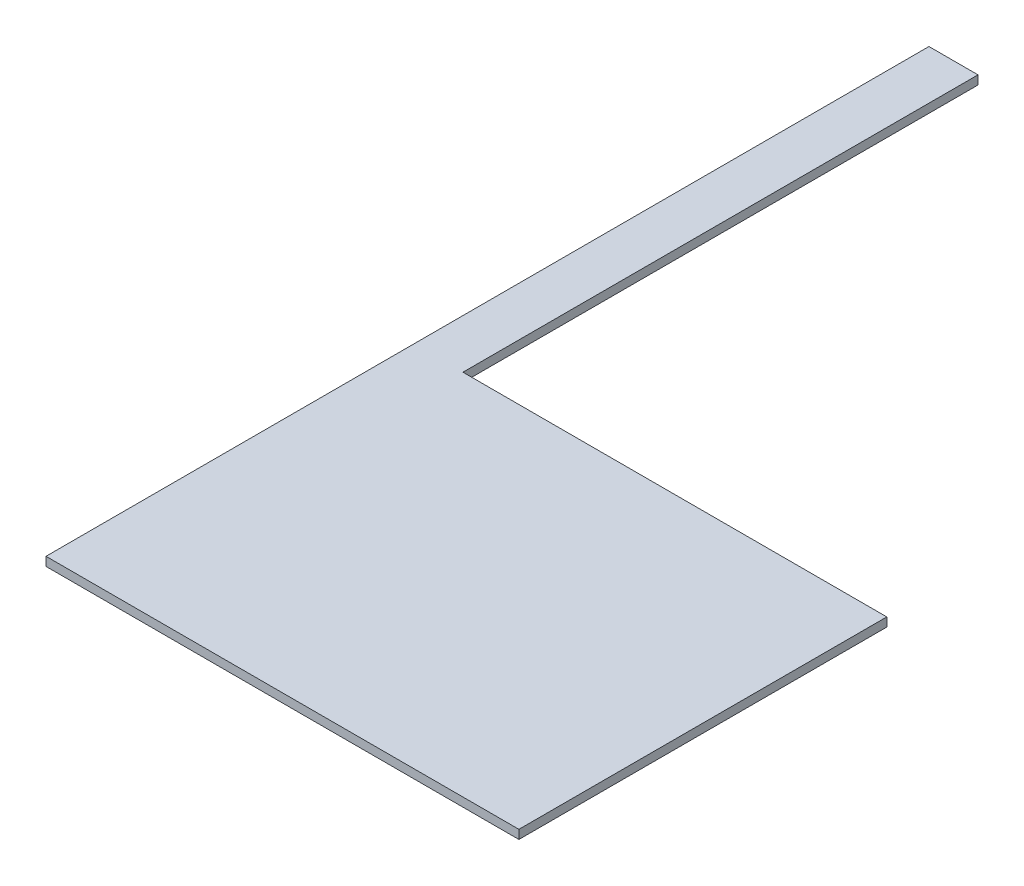
ISO-10303-21;
HEADER;
FILE_DESCRIPTION(('STEP AP214'),'2;1');
FILE_NAME('part.step','',(''),(''),'','','');
FILE_SCHEMA(('AUTOMOTIVE_DESIGN { 1 0 10303 214 1 1 1 1 }'));
ENDSEC;
DATA;
#1=APPLICATION_CONTEXT('core data for automotive mechanical design processes');
#2=APPLICATION_PROTOCOL_DEFINITION('international standard','automotive_design',2000,#1);
#3=PRODUCT_CONTEXT('',#1,'mechanical');
#4=PRODUCT('Part','Part','',(#3));
#5=PRODUCT_RELATED_PRODUCT_CATEGORY('part','',(#4));
#6=PRODUCT_DEFINITION_FORMATION('','',#4);
#7=PRODUCT_DEFINITION_CONTEXT('part definition',#1,'design');
#8=PRODUCT_DEFINITION('design','',#6,#7);
#9=PRODUCT_DEFINITION_SHAPE('','',#8);
#10=(LENGTH_UNIT() NAMED_UNIT(*) SI_UNIT(.MILLI.,.METRE.));
#11=(NAMED_UNIT(*) PLANE_ANGLE_UNIT() SI_UNIT($,.RADIAN.));
#12=(NAMED_UNIT(*) SI_UNIT($,.STERADIAN.) SOLID_ANGLE_UNIT());
#13=UNCERTAINTY_MEASURE_WITH_UNIT(LENGTH_MEASURE(1.E-05),#10,'distance_accuracy_value','');
#14=(GEOMETRIC_REPRESENTATION_CONTEXT(3) GLOBAL_UNCERTAINTY_ASSIGNED_CONTEXT((#13)) GLOBAL_UNIT_ASSIGNED_CONTEXT((#10,
#11,#12)) REPRESENTATION_CONTEXT('',''));
#15=CARTESIAN_POINT('',(0.,0.,0.));
#16=DIRECTION('',(0.,0.,1.));
#17=DIRECTION('',(1.,0.,0.));
#18=AXIS2_PLACEMENT_3D('',#15,#16,#17);
#19=CARTESIAN_POINT('',(-388.14375,18.25625,-381.));
#20=DIRECTION('',(0.,0.,1.));
#21=DIRECTION('',(1.,0.,0.));
#22=AXIS2_PLACEMENT_3D('',#19,#20,#21);
#23=PLANE('',#22);
#24=DIRECTION('',(-1.,0.,0.));
#25=VECTOR('',#24,1.);
#26=CARTESIAN_POINT('',(-388.14375,0.,-381.));
#27=LINE('',#26,#25);
#28=CARTESIAN_POINT('',(489.74375,0.,-381.));
#29=VERTEX_POINT('',#28);
#30=CARTESIAN_POINT('',(-388.14375,0.,-381.));
#31=VERTEX_POINT('',#30);
#32=EDGE_CURVE('E127',#29,#31,#27,.T.);
#33=ORIENTED_EDGE('',*,*,#32,.T.);
#34=DIRECTION('',(0.,-1.,0.));
#35=VECTOR('',#34,1.);
#36=CARTESIAN_POINT('',(-388.14375,18.25625,-381.));
#37=LINE('',#36,#35);
#38=CARTESIAN_POINT('',(-388.14375,18.25625,-381.));
#39=VERTEX_POINT('',#38);
#40=EDGE_CURVE('E11',#39,#31,#37,.T.);
#41=ORIENTED_EDGE('',*,*,#40,.F.);
#42=DIRECTION('',(-1.,0.,0.));
#43=VECTOR('',#42,1.);
#44=CARTESIAN_POINT('',(-388.14375,18.25625,-381.));
#45=LINE('',#44,#43);
#46=CARTESIAN_POINT('',(489.74375,18.25625,-381.));
#47=VERTEX_POINT('',#46);
#48=EDGE_CURVE('E144',#47,#39,#45,.T.);
#49=ORIENTED_EDGE('',*,*,#48,.F.);
#50=DIRECTION('',(0.,-1.,0.));
#51=VECTOR('',#50,1.);
#52=CARTESIAN_POINT('',(489.74375,18.25625,-381.));
#53=LINE('',#52,#51);
#54=EDGE_CURVE('E123',#47,#29,#53,.T.);
#55=ORIENTED_EDGE('',*,*,#54,.T.);
#56=EDGE_LOOP('',(#33,#41,#49,#55));
#57=FACE_BOUND('',#56,.T.);
#58=ADVANCED_FACE('F39',(#57),#23,.F.);
#59=CARTESIAN_POINT('',(-388.14375,18.25625,-1447.8));
#60=DIRECTION('',(-1.,0.,0.));
#61=DIRECTION('',(0.,0.,1.));
#62=AXIS2_PLACEMENT_3D('',#59,#60,#61);
#63=PLANE('',#62);
#64=DIRECTION('',(0.,0.,-1.));
#65=VECTOR('',#64,1.);
#66=CARTESIAN_POINT('',(-388.14375,0.,-1447.8));
#67=LINE('',#66,#65);
#68=CARTESIAN_POINT('',(-388.14375,0.,-1447.8));
#69=VERTEX_POINT('',#68);
#70=EDGE_CURVE('E131',#31,#69,#67,.T.);
#71=ORIENTED_EDGE('',*,*,#70,.T.);
#72=DIRECTION('',(0.,-1.,0.));
#73=VECTOR('',#72,1.);
#74=CARTESIAN_POINT('',(-388.14375,18.25625,-1447.8));
#75=LINE('',#74,#73);
#76=CARTESIAN_POINT('',(-388.14375,18.25625,-1447.8));
#77=VERTEX_POINT('',#76);
#78=EDGE_CURVE('E48',#77,#69,#75,.T.);
#79=ORIENTED_EDGE('',*,*,#78,.F.);
#80=DIRECTION('',(0.,0.,-1.));
#81=VECTOR('',#80,1.);
#82=CARTESIAN_POINT('',(-388.14375,18.25625,-1447.8));
#83=LINE('',#82,#81);
#84=EDGE_CURVE('E93',#39,#77,#83,.T.);
#85=ORIENTED_EDGE('',*,*,#84,.F.);
#86=ORIENTED_EDGE('',*,*,#40,.T.);
#87=EDGE_LOOP('',(#71,#79,#85,#86));
#88=FACE_BOUND('',#87,.T.);
#89=ADVANCED_FACE('F172',(#88),#63,.F.);
#90=CARTESIAN_POINT('',(-489.74375,18.25625,-1447.8));
#91=DIRECTION('',(0.,0.,1.));
#92=DIRECTION('',(1.,0.,0.));
#93=AXIS2_PLACEMENT_3D('',#90,#91,#92);
#94=PLANE('',#93);
#95=DIRECTION('',(-1.,0.,0.));
#96=VECTOR('',#95,1.);
#97=CARTESIAN_POINT('',(-489.74375,0.,-1447.8));
#98=LINE('',#97,#96);
#99=CARTESIAN_POINT('',(-489.74375,0.,-1447.8));
#100=VERTEX_POINT('',#99);
#101=EDGE_CURVE('E134',#69,#100,#98,.T.);
#102=ORIENTED_EDGE('',*,*,#101,.T.);
#103=DIRECTION('',(0.,-1.,0.));
#104=VECTOR('',#103,1.);
#105=CARTESIAN_POINT('',(-489.74375,18.25625,-1447.8));
#106=LINE('',#105,#104);
#107=CARTESIAN_POINT('',(-489.74375,18.25625,-1447.8));
#108=VERTEX_POINT('',#107);
#109=EDGE_CURVE('E116',#108,#100,#106,.T.);
#110=ORIENTED_EDGE('',*,*,#109,.F.);
#111=DIRECTION('',(-1.,0.,0.));
#112=VECTOR('',#111,1.);
#113=CARTESIAN_POINT('',(-489.74375,18.25625,-1447.8));
#114=LINE('',#113,#112);
#115=EDGE_CURVE('E106',#77,#108,#114,.T.);
#116=ORIENTED_EDGE('',*,*,#115,.F.);
#117=ORIENTED_EDGE('',*,*,#78,.T.);
#118=EDGE_LOOP('',(#102,#110,#116,#117));
#119=FACE_BOUND('',#118,.T.);
#120=ADVANCED_FACE('F154',(#119),#94,.F.);
#121=CARTESIAN_POINT('',(-489.74375,18.25625,381.));
#122=DIRECTION('',(1.,0.,0.));
#123=DIRECTION('',(0.,0.,-1.));
#124=AXIS2_PLACEMENT_3D('',#121,#122,#123);
#125=PLANE('',#124);
#126=DIRECTION('',(0.,0.,1.));
#127=VECTOR('',#126,1.);
#128=CARTESIAN_POINT('',(-489.74375,0.,381.));
#129=LINE('',#128,#127);
#130=CARTESIAN_POINT('',(-489.74375,0.,381.));
#131=VERTEX_POINT('',#130);
#132=EDGE_CURVE('E114',#100,#131,#129,.T.);
#133=ORIENTED_EDGE('',*,*,#132,.T.);
#134=DIRECTION('',(0.,-1.,0.));
#135=VECTOR('',#134,1.);
#136=CARTESIAN_POINT('',(-489.74375,18.25625,381.));
#137=LINE('',#136,#135);
#138=CARTESIAN_POINT('',(-489.74375,18.25625,381.));
#139=VERTEX_POINT('',#138);
#140=EDGE_CURVE('E112',#139,#131,#137,.T.);
#141=ORIENTED_EDGE('',*,*,#140,.F.);
#142=DIRECTION('',(0.,0.,1.));
#143=VECTOR('',#142,1.);
#144=CARTESIAN_POINT('',(-489.74375,18.25625,-381.));
#145=LINE('',#144,#143);
#146=EDGE_CURVE('E100',#108,#139,#145,.T.);
#147=ORIENTED_EDGE('',*,*,#146,.F.);
#148=ORIENTED_EDGE('',*,*,#109,.T.);
#149=EDGE_LOOP('',(#133,#141,#147,#148));
#150=FACE_BOUND('',#149,.T.);
#151=ADVANCED_FACE('F113',(#150),#125,.F.);
#152=CARTESIAN_POINT('',(-489.74375,18.25625,381.));
#153=DIRECTION('',(0.,0.,-1.));
#154=DIRECTION('',(-1.,0.,0.));
#155=AXIS2_PLACEMENT_3D('',#152,#153,#154);
#156=PLANE('',#155);
#157=DIRECTION('',(1.,0.,0.));
#158=VECTOR('',#157,1.);
#159=CARTESIAN_POINT('',(-489.74375,0.,381.));
#160=LINE('',#159,#158);
#161=CARTESIAN_POINT('',(489.74375,0.,381.));
#162=VERTEX_POINT('',#161);
#163=EDGE_CURVE('E79',#131,#162,#160,.T.);
#164=ORIENTED_EDGE('',*,*,#163,.T.);
#165=DIRECTION('',(0.,-1.,0.));
#166=VECTOR('',#165,1.);
#167=CARTESIAN_POINT('',(489.74375,18.25625,381.));
#168=LINE('',#167,#166);
#169=CARTESIAN_POINT('',(489.74375,18.25625,381.));
#170=VERTEX_POINT('',#169);
#171=EDGE_CURVE('E117',#170,#162,#168,.T.);
#172=ORIENTED_EDGE('',*,*,#171,.F.);
#173=DIRECTION('',(1.,0.,0.));
#174=VECTOR('',#173,1.);
#175=CARTESIAN_POINT('',(-489.74375,18.25625,381.));
#176=LINE('',#175,#174);
#177=EDGE_CURVE('E104',#139,#170,#176,.T.);
#178=ORIENTED_EDGE('',*,*,#177,.F.);
#179=ORIENTED_EDGE('',*,*,#140,.T.);
#180=EDGE_LOOP('',(#164,#172,#178,#179));
#181=FACE_BOUND('',#180,.T.);
#182=ADVANCED_FACE('F119',(#181),#156,.F.);
#183=CARTESIAN_POINT('',(489.74375,18.25625,381.));
#184=DIRECTION('',(-1.,0.,0.));
#185=DIRECTION('',(0.,0.,1.));
#186=AXIS2_PLACEMENT_3D('',#183,#184,#185);
#187=PLANE('',#186);
#188=DIRECTION('',(0.,0.,-1.));
#189=VECTOR('',#188,1.);
#190=CARTESIAN_POINT('',(489.74375,0.,381.));
#191=LINE('',#190,#189);
#192=EDGE_CURVE('E85',#162,#29,#191,.T.);
#193=ORIENTED_EDGE('',*,*,#192,.T.);
#194=ORIENTED_EDGE('',*,*,#54,.F.);
#195=DIRECTION('',(0.,0.,-1.));
#196=VECTOR('',#195,1.);
#197=CARTESIAN_POINT('',(489.74375,18.25625,381.));
#198=LINE('',#197,#196);
#199=EDGE_CURVE('E56',#170,#47,#198,.T.);
#200=ORIENTED_EDGE('',*,*,#199,.F.);
#201=ORIENTED_EDGE('',*,*,#171,.T.);
#202=EDGE_LOOP('',(#193,#194,#200,#201));
#203=FACE_BOUND('',#202,.T.);
#204=ADVANCED_FACE('F161',(#203),#187,.F.);
#205=CARTESIAN_POINT('',(0.,18.25625,0.));
#206=DIRECTION('',(0.,1.,0.));
#207=DIRECTION('',(0.,0.,1.));
#208=AXIS2_PLACEMENT_3D('',#205,#206,#207);
#209=PLANE('',#208);
#210=ORIENTED_EDGE('',*,*,#48,.T.);
#211=ORIENTED_EDGE('',*,*,#84,.T.);
#212=ORIENTED_EDGE('',*,*,#115,.T.);
#213=ORIENTED_EDGE('',*,*,#146,.T.);
#214=ORIENTED_EDGE('',*,*,#177,.T.);
#215=ORIENTED_EDGE('',*,*,#199,.T.);
#216=EDGE_LOOP('',(#210,#211,#212,#213,#214,#215));
#217=FACE_BOUND('',#216,.T.);
#218=ADVANCED_FACE('F102',(#217),#209,.T.);
#219=CARTESIAN_POINT('',(0.,0.,0.));
#220=DIRECTION('',(0.,1.,0.));
#221=DIRECTION('',(0.,0.,1.));
#222=AXIS2_PLACEMENT_3D('',#219,#220,#221);
#223=PLANE('',#222);
#224=ORIENTED_EDGE('',*,*,#32,.F.);
#225=ORIENTED_EDGE('',*,*,#192,.F.);
#226=ORIENTED_EDGE('',*,*,#163,.F.);
#227=ORIENTED_EDGE('',*,*,#132,.F.);
#228=ORIENTED_EDGE('',*,*,#101,.F.);
#229=ORIENTED_EDGE('',*,*,#70,.F.);
#230=EDGE_LOOP('',(#224,#225,#226,#227,#228,#229));
#231=FACE_BOUND('',#230,.T.);
#232=ADVANCED_FACE('F157',(#231),#223,.F.);
#233=CLOSED_SHELL('',(#58,#89,#120,#151,#182,#204,#218,#232));
#234=MANIFOLD_SOLID_BREP('B2',#233);
#235=ADVANCED_BREP_SHAPE_REPRESENTATION('',(#18,#234),#14);
#236=SHAPE_DEFINITION_REPRESENTATION(#9,#235);
ENDSEC;
END-ISO-10303-21;
